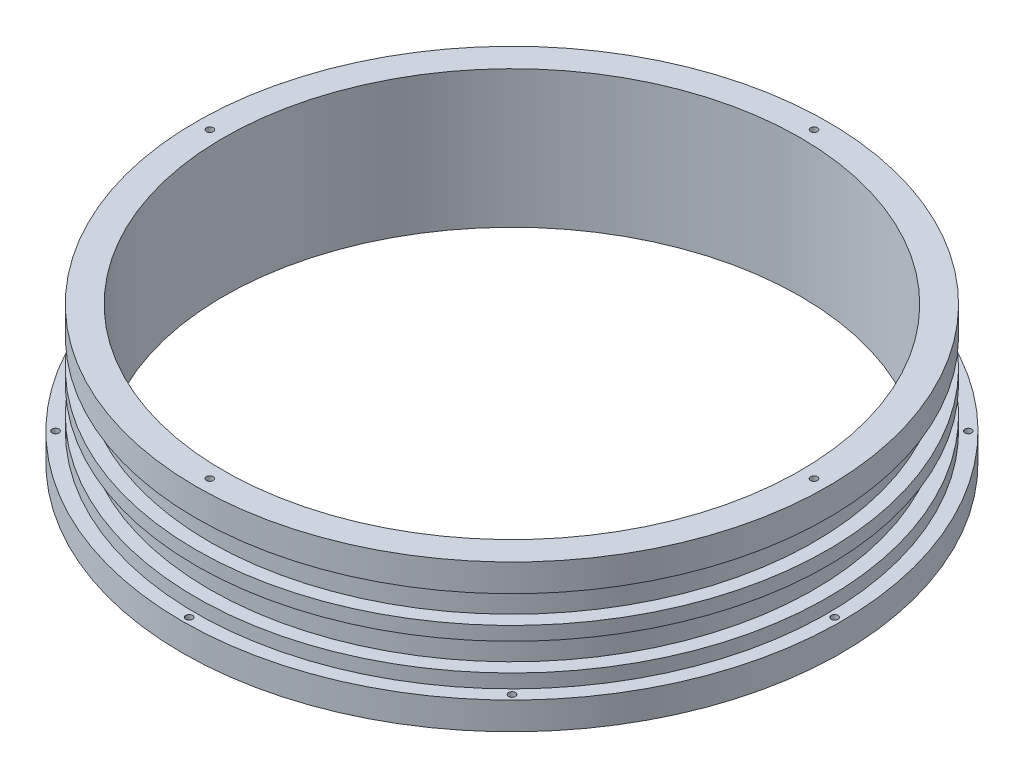
ISO-10303-21;
HEADER;
FILE_DESCRIPTION(('STEP AP214'),'2;1');
FILE_NAME('part.step','',(''),(''),'','','');
FILE_SCHEMA(('AUTOMOTIVE_DESIGN { 1 0 10303 214 1 1 1 1 }'));
ENDSEC;
DATA;
#1=APPLICATION_CONTEXT('core data for automotive mechanical design processes');
#2=APPLICATION_PROTOCOL_DEFINITION('international standard','automotive_design',2000,#1);
#3=PRODUCT_CONTEXT('',#1,'mechanical');
#4=PRODUCT('Part','Part','',(#3));
#5=PRODUCT_RELATED_PRODUCT_CATEGORY('part','',(#4));
#6=PRODUCT_DEFINITION_FORMATION('','',#4);
#7=PRODUCT_DEFINITION_CONTEXT('part definition',#1,'design');
#8=PRODUCT_DEFINITION('design','',#6,#7);
#9=PRODUCT_DEFINITION_SHAPE('','',#8);
#10=(LENGTH_UNIT() NAMED_UNIT(*) SI_UNIT(.MILLI.,.METRE.));
#11=(NAMED_UNIT(*) PLANE_ANGLE_UNIT() SI_UNIT($,.RADIAN.));
#12=(NAMED_UNIT(*) SI_UNIT($,.STERADIAN.) SOLID_ANGLE_UNIT());
#13=UNCERTAINTY_MEASURE_WITH_UNIT(LENGTH_MEASURE(1.E-05),#10,'distance_accuracy_value','');
#14=(GEOMETRIC_REPRESENTATION_CONTEXT(3) GLOBAL_UNCERTAINTY_ASSIGNED_CONTEXT((#13)) GLOBAL_UNIT_ASSIGNED_CONTEXT((#10,
#11,#12)) REPRESENTATION_CONTEXT('',''));
#15=CARTESIAN_POINT('',(0.,0.,0.));
#16=DIRECTION('',(0.,0.,1.));
#17=DIRECTION('',(1.,0.,0.));
#18=AXIS2_PLACEMENT_3D('',#15,#16,#17);
#19=CARTESIAN_POINT('',(0.,0.,0.));
#20=DIRECTION('',(0.,1.,0.));
#21=DIRECTION('',(0.,0.,1.));
#22=AXIS2_PLACEMENT_3D('',#19,#20,#21);
#23=PLANE('',#22);
#24=CARTESIAN_POINT('',(0.,0.,0.));
#25=DIRECTION('',(0.,-1.,0.));
#26=DIRECTION('',(0.,0.,-1.));
#27=AXIS2_PLACEMENT_3D('',#24,#25,#26);
#28=CIRCLE('',#27,66.675);
#29=CARTESIAN_POINT('',(0.,0.,-66.675));
#30=VERTEX_POINT('',#29);
#31=EDGE_CURVE('E73',#30,#30,#28,.T.);
#32=ORIENTED_EDGE('',*,*,#31,.F.);
#33=EDGE_LOOP('',(#32));
#34=FACE_BOUND('',#33,.T.);
#35=CARTESIAN_POINT('',(0.,0.,0.));
#36=DIRECTION('',(0.,-1.,0.));
#37=DIRECTION('',(0.,0.,-1.));
#38=AXIS2_PLACEMENT_3D('',#35,#36,#37);
#39=CIRCLE('',#38,69.85);
#40=CARTESIAN_POINT('',(0.,0.,-69.85));
#41=VERTEX_POINT('',#40);
#42=EDGE_CURVE('E133',#41,#41,#39,.T.);
#43=ORIENTED_EDGE('',*,*,#42,.T.);
#44=EDGE_LOOP('',(#43));
#45=FACE_BOUND('',#44,.T.);
#46=ADVANCED_FACE('F31',(#34,#45),#23,.F.);
#47=CARTESIAN_POINT('',(0.,19.05,0.));
#48=DIRECTION('',(0.,1.,0.));
#49=DIRECTION('',(0.,0.,1.));
#50=AXIS2_PLACEMENT_3D('',#47,#48,#49);
#51=PLANE('',#50);
#52=CARTESIAN_POINT('',(0.,19.05,0.));
#53=DIRECTION('',(0.,1.,0.));
#54=DIRECTION('',(0.,0.,1.));
#55=AXIS2_PLACEMENT_3D('',#52,#53,#54);
#56=CIRCLE('',#55,73.025);
#57=CARTESIAN_POINT('',(0.,19.05,73.025));
#58=VERTEX_POINT('',#57);
#59=EDGE_CURVE('E54',#58,#58,#56,.T.);
#60=ORIENTED_EDGE('',*,*,#59,.T.);
#61=EDGE_LOOP('',(#60));
#62=FACE_BOUND('',#61,.T.);
#63=CARTESIAN_POINT('',(0.,19.05,0.));
#64=DIRECTION('',(0.,1.,0.));
#65=DIRECTION('',(0.,0.,1.));
#66=AXIS2_PLACEMENT_3D('',#63,#64,#65);
#67=CIRCLE('',#66,69.85);
#68=CARTESIAN_POINT('',(0.,19.05,69.85));
#69=VERTEX_POINT('',#68);
#70=EDGE_CURVE('E61',#69,#69,#67,.T.);
#71=ORIENTED_EDGE('',*,*,#70,.F.);
#72=EDGE_LOOP('',(#71));
#73=FACE_BOUND('',#72,.T.);
#74=ADVANCED_FACE('F206',(#62,#73),#51,.T.);
#75=CARTESIAN_POINT('',(0.,9.525,0.));
#76=DIRECTION('',(0.,1.,0.));
#77=DIRECTION('',(0.,0.,1.));
#78=AXIS2_PLACEMENT_3D('',#75,#76,#77);
#79=PLANE('',#78);
#80=CARTESIAN_POINT('',(0.,9.525,0.));
#81=DIRECTION('',(0.,1.,0.));
#82=DIRECTION('',(0.,0.,1.));
#83=AXIS2_PLACEMENT_3D('',#80,#81,#82);
#84=CIRCLE('',#83,73.025);
#85=CARTESIAN_POINT('',(0.,9.525,-73.025));
#86=VERTEX_POINT('',#85);
#87=EDGE_CURVE('E48',#86,#86,#84,.T.);
#88=ORIENTED_EDGE('',*,*,#87,.T.);
#89=EDGE_LOOP('',(#88));
#90=FACE_BOUND('',#89,.T.);
#91=CARTESIAN_POINT('',(0.,9.525,0.));
#92=DIRECTION('',(0.,1.,0.));
#93=DIRECTION('',(0.,0.,1.));
#94=AXIS2_PLACEMENT_3D('',#91,#92,#93);
#95=CIRCLE('',#94,69.85);
#96=CARTESIAN_POINT('',(0.,9.525,69.85));
#97=VERTEX_POINT('',#96);
#98=EDGE_CURVE('E35',#97,#97,#95,.F.);
#99=ORIENTED_EDGE('',*,*,#98,.T.);
#100=EDGE_LOOP('',(#99));
#101=FACE_BOUND('',#100,.T.);
#102=ADVANCED_FACE('F208',(#90,#101),#79,.T.);
#103=CARTESIAN_POINT('',(0.,6.35,0.));
#104=DIRECTION('',(0.,1.,0.));
#105=DIRECTION('',(0.,0.,1.));
#106=AXIS2_PLACEMENT_3D('',#103,#104,#105);
#107=PLANE('',#106);
#108=CARTESIAN_POINT('',(-52.7590047112795,6.35,-52.7590047112769));
#109=DIRECTION('',(0.,1.,0.));
#110=DIRECTION('',(0.,0.,1.));
#111=AXIS2_PLACEMENT_3D('',#108,#109,#110);
#112=CIRCLE('',#111,0.793749999999999);
#113=CARTESIAN_POINT('',(-52.7590047112795,6.35,-51.9652547112769));
#114=VERTEX_POINT('',#113);
#115=EDGE_CURVE('E121',#114,#114,#112,.T.);
#116=ORIENTED_EDGE('',*,*,#115,.F.);
#117=EDGE_LOOP('',(#116));
#118=FACE_BOUND('',#117,.T.);
#119=CARTESIAN_POINT('',(-74.6124999999938,6.35,6.22677805551278E-12));
#120=DIRECTION('',(0.,1.,0.));
#121=DIRECTION('',(0.,0.,1.));
#122=AXIS2_PLACEMENT_3D('',#119,#120,#121);
#123=CIRCLE('',#122,0.793749999999993);
#124=CARTESIAN_POINT('',(-74.6124999999938,6.35,0.793750000006219));
#125=VERTEX_POINT('',#124);
#126=EDGE_CURVE('E115',#125,#125,#123,.T.);
#127=ORIENTED_EDGE('',*,*,#126,.F.);
#128=EDGE_LOOP('',(#127));
#129=FACE_BOUND('',#128,.T.);
#130=CARTESIAN_POINT('',(-52.7590047112707,6.35,52.7590047112857));
#131=DIRECTION('',(0.,1.,0.));
#132=DIRECTION('',(0.,0.,1.));
#133=AXIS2_PLACEMENT_3D('',#130,#131,#132);
#134=CIRCLE('',#133,0.793749999999993);
#135=CARTESIAN_POINT('',(-52.7590047112707,6.35,53.5527547112857));
#136=VERTEX_POINT('',#135);
#137=EDGE_CURVE('E109',#136,#136,#134,.T.);
#138=ORIENTED_EDGE('',*,*,#137,.F.);
#139=EDGE_LOOP('',(#138));
#140=FACE_BOUND('',#139,.T.);
#141=CARTESIAN_POINT('',(1.24352813191653E-11,6.35,74.6125));
#142=DIRECTION('',(0.,1.,0.));
#143=DIRECTION('',(0.,0.,1.));
#144=AXIS2_PLACEMENT_3D('',#141,#142,#143);
#145=CIRCLE('',#144,0.79375);
#146=CARTESIAN_POINT('',(1.24352813191653E-11,6.35,75.40625));
#147=VERTEX_POINT('',#146);
#148=EDGE_CURVE('E103',#147,#147,#145,.T.);
#149=ORIENTED_EDGE('',*,*,#148,.F.);
#150=EDGE_LOOP('',(#149));
#151=FACE_BOUND('',#150,.T.);
#152=CARTESIAN_POINT('',(52.7590047112919,6.35,52.7590047112769));
#153=DIRECTION('',(0.,1.,0.));
#154=DIRECTION('',(0.,0.,1.));
#155=AXIS2_PLACEMENT_3D('',#152,#153,#154);
#156=CIRCLE('',#155,0.793749999999993);
#157=CARTESIAN_POINT('',(52.7590047112919,6.35,53.5527547112769));
#158=VERTEX_POINT('',#157);
#159=EDGE_CURVE('E97',#158,#158,#156,.T.);
#160=ORIENTED_EDGE('',*,*,#159,.F.);
#161=EDGE_LOOP('',(#160));
#162=FACE_BOUND('',#161,.T.);
#163=CARTESIAN_POINT('',(74.6125000000062,6.35,-6.21764065958264E-12));
#164=DIRECTION('',(0.,1.,0.));
#165=DIRECTION('',(0.,0.,1.));
#166=AXIS2_PLACEMENT_3D('',#163,#164,#165);
#167=CIRCLE('',#166,0.793749999999993);
#168=CARTESIAN_POINT('',(74.6125000000062,6.35,0.793749999993775));
#169=VERTEX_POINT('',#168);
#170=EDGE_CURVE('E91',#169,#169,#167,.T.);
#171=ORIENTED_EDGE('',*,*,#170,.F.);
#172=EDGE_LOOP('',(#171));
#173=FACE_BOUND('',#172,.T.);
#174=CARTESIAN_POINT('',(52.7590047112831,6.35,-52.7590047112857));
#175=DIRECTION('',(0.,1.,0.));
#176=DIRECTION('',(0.,0.,1.));
#177=AXIS2_PLACEMENT_3D('',#174,#175,#176);
#178=CIRCLE('',#177,0.793749999999993);
#179=CARTESIAN_POINT('',(52.7590047112831,6.35,-51.9652547112857));
#180=VERTEX_POINT('',#179);
#181=EDGE_CURVE('E85',#180,#180,#178,.T.);
#182=ORIENTED_EDGE('',*,*,#181,.F.);
#183=EDGE_LOOP('',(#182));
#184=FACE_BOUND('',#183,.T.);
#185=CARTESIAN_POINT('',(0.,6.35,-74.6125));
#186=DIRECTION('',(0.,1.,0.));
#187=DIRECTION('',(0.,0.,1.));
#188=AXIS2_PLACEMENT_3D('',#185,#186,#187);
#189=CIRCLE('',#188,0.79375);
#190=CARTESIAN_POINT('',(0.,6.35,-73.81875));
#191=VERTEX_POINT('',#190);
#192=EDGE_CURVE('E79',#191,#191,#189,.T.);
#193=ORIENTED_EDGE('',*,*,#192,.F.);
#194=EDGE_LOOP('',(#193));
#195=FACE_BOUND('',#194,.T.);
#196=CARTESIAN_POINT('',(0.,6.35,0.));
#197=DIRECTION('',(0.,1.,0.));
#198=DIRECTION('',(0.,0.,1.));
#199=AXIS2_PLACEMENT_3D('',#196,#197,#198);
#200=CIRCLE('',#199,76.2);
#201=CARTESIAN_POINT('',(0.,6.35,76.2));
#202=VERTEX_POINT('',#201);
#203=EDGE_CURVE('E10',#202,#202,#200,.T.);
#204=ORIENTED_EDGE('',*,*,#203,.T.);
#205=EDGE_LOOP('',(#204));
#206=FACE_BOUND('',#205,.T.);
#207=CARTESIAN_POINT('',(0.,6.35,0.));
#208=DIRECTION('',(0.,1.,0.));
#209=DIRECTION('',(0.,0.,1.));
#210=AXIS2_PLACEMENT_3D('',#207,#208,#209);
#211=CIRCLE('',#210,73.025);
#212=CARTESIAN_POINT('',(0.,6.35,-73.025));
#213=VERTEX_POINT('',#212);
#214=EDGE_CURVE('E44',#213,#213,#211,.F.);
#215=ORIENTED_EDGE('',*,*,#214,.T.);
#216=EDGE_LOOP('',(#215));
#217=FACE_BOUND('',#216,.T.);
#218=ADVANCED_FACE('F215',(#118,#129,#140,#151,#162,#173,#184,#195,#206,#217),#107,.T.);
#219=CARTESIAN_POINT('',(0.,6.35,0.));
#220=DIRECTION('',(0.,-1.,0.));
#221=DIRECTION('',(0.,0.,-1.));
#222=AXIS2_PLACEMENT_3D('',#219,#220,#221);
#223=CYLINDRICAL_SURFACE('',#222,76.2);
#224=ORIENTED_EDGE('',*,*,#203,.F.);
#225=EDGE_LOOP('',(#224));
#226=FACE_BOUND('',#225,.T.);
#227=CARTESIAN_POINT('',(0.,0.,0.));
#228=DIRECTION('',(0.,1.,0.));
#229=DIRECTION('',(0.,0.,1.));
#230=AXIS2_PLACEMENT_3D('',#227,#228,#229);
#231=CIRCLE('',#230,76.2);
#232=CARTESIAN_POINT('',(0.,0.,76.2));
#233=VERTEX_POINT('',#232);
#234=EDGE_CURVE('E39',#233,#233,#231,.T.);
#235=ORIENTED_EDGE('',*,*,#234,.T.);
#236=EDGE_LOOP('',(#235));
#237=FACE_BOUND('',#236,.T.);
#238=ADVANCED_FACE('F33',(#226,#237),#223,.T.);
#239=CARTESIAN_POINT('',(0.,0.,0.));
#240=DIRECTION('',(0.,-1.,0.));
#241=DIRECTION('',(0.,0.,-1.));
#242=AXIS2_PLACEMENT_3D('',#239,#240,#241);
#243=CIRCLE('',#242,73.025);
#244=CARTESIAN_POINT('',(0.,0.,-73.025));
#245=VERTEX_POINT('',#244);
#246=EDGE_CURVE('E127',#245,#245,#243,.T.);
#247=ORIENTED_EDGE('',*,*,#246,.F.);
#248=EDGE_LOOP('',(#247));
#249=FACE_BOUND('',#248,.T.);
#250=CARTESIAN_POINT('',(-52.7590047112795,0.,-52.7590047112769));
#251=DIRECTION('',(0.,1.,0.));
#252=DIRECTION('',(0.,0.,1.));
#253=AXIS2_PLACEMENT_3D('',#250,#251,#252);
#254=CIRCLE('',#253,0.793749999999999);
#255=CARTESIAN_POINT('',(-52.7590047112795,0.,-51.9652547112769));
#256=VERTEX_POINT('',#255);
#257=EDGE_CURVE('E118',#256,#256,#254,.T.);
#258=ORIENTED_EDGE('',*,*,#257,.T.);
#259=EDGE_LOOP('',(#258));
#260=FACE_BOUND('',#259,.T.);
#261=CARTESIAN_POINT('',(-74.6124999999938,0.,6.22677805551278E-12));
#262=DIRECTION('',(0.,1.,0.));
#263=DIRECTION('',(0.,0.,1.));
#264=AXIS2_PLACEMENT_3D('',#261,#262,#263);
#265=CIRCLE('',#264,0.793749999999993);
#266=CARTESIAN_POINT('',(-74.6124999999938,0.,0.793750000006219));
#267=VERTEX_POINT('',#266);
#268=EDGE_CURVE('E112',#267,#267,#265,.T.);
#269=ORIENTED_EDGE('',*,*,#268,.T.);
#270=EDGE_LOOP('',(#269));
#271=FACE_BOUND('',#270,.T.);
#272=CARTESIAN_POINT('',(-52.7590047112707,0.,52.7590047112857));
#273=DIRECTION('',(0.,1.,0.));
#274=DIRECTION('',(0.,0.,1.));
#275=AXIS2_PLACEMENT_3D('',#272,#273,#274);
#276=CIRCLE('',#275,0.793749999999993);
#277=CARTESIAN_POINT('',(-52.7590047112707,0.,53.5527547112857));
#278=VERTEX_POINT('',#277);
#279=EDGE_CURVE('E106',#278,#278,#276,.T.);
#280=ORIENTED_EDGE('',*,*,#279,.T.);
#281=EDGE_LOOP('',(#280));
#282=FACE_BOUND('',#281,.T.);
#283=CARTESIAN_POINT('',(1.24352813191653E-11,0.,74.6125));
#284=DIRECTION('',(0.,1.,0.));
#285=DIRECTION('',(0.,0.,1.));
#286=AXIS2_PLACEMENT_3D('',#283,#284,#285);
#287=CIRCLE('',#286,0.79375);
#288=CARTESIAN_POINT('',(1.24352813191653E-11,0.,75.40625));
#289=VERTEX_POINT('',#288);
#290=EDGE_CURVE('E100',#289,#289,#287,.T.);
#291=ORIENTED_EDGE('',*,*,#290,.T.);
#292=EDGE_LOOP('',(#291));
#293=FACE_BOUND('',#292,.T.);
#294=CARTESIAN_POINT('',(52.7590047112919,0.,52.7590047112769));
#295=DIRECTION('',(0.,1.,0.));
#296=DIRECTION('',(0.,0.,1.));
#297=AXIS2_PLACEMENT_3D('',#294,#295,#296);
#298=CIRCLE('',#297,0.793749999999993);
#299=CARTESIAN_POINT('',(52.7590047112919,0.,53.5527547112769));
#300=VERTEX_POINT('',#299);
#301=EDGE_CURVE('E94',#300,#300,#298,.T.);
#302=ORIENTED_EDGE('',*,*,#301,.T.);
#303=EDGE_LOOP('',(#302));
#304=FACE_BOUND('',#303,.T.);
#305=CARTESIAN_POINT('',(74.6125000000062,0.,-6.21764065958264E-12));
#306=DIRECTION('',(0.,1.,0.));
#307=DIRECTION('',(0.,0.,1.));
#308=AXIS2_PLACEMENT_3D('',#305,#306,#307);
#309=CIRCLE('',#308,0.793749999999993);
#310=CARTESIAN_POINT('',(74.6125000000062,0.,0.793749999993775));
#311=VERTEX_POINT('',#310);
#312=EDGE_CURVE('E88',#311,#311,#309,.T.);
#313=ORIENTED_EDGE('',*,*,#312,.T.);
#314=EDGE_LOOP('',(#313));
#315=FACE_BOUND('',#314,.T.);
#316=CARTESIAN_POINT('',(52.7590047112831,0.,-52.7590047112857));
#317=DIRECTION('',(0.,1.,0.));
#318=DIRECTION('',(0.,0.,1.));
#319=AXIS2_PLACEMENT_3D('',#316,#317,#318);
#320=CIRCLE('',#319,0.793749999999993);
#321=CARTESIAN_POINT('',(52.7590047112831,0.,-51.9652547112857));
#322=VERTEX_POINT('',#321);
#323=EDGE_CURVE('E82',#322,#322,#320,.T.);
#324=ORIENTED_EDGE('',*,*,#323,.T.);
#325=EDGE_LOOP('',(#324));
#326=FACE_BOUND('',#325,.T.);
#327=CARTESIAN_POINT('',(0.,0.,-74.6125));
#328=DIRECTION('',(0.,1.,0.));
#329=DIRECTION('',(0.,0.,1.));
#330=AXIS2_PLACEMENT_3D('',#327,#328,#329);
#331=CIRCLE('',#330,0.79375);
#332=CARTESIAN_POINT('',(0.,0.,-73.81875));
#333=VERTEX_POINT('',#332);
#334=EDGE_CURVE('E76',#333,#333,#331,.T.);
#335=ORIENTED_EDGE('',*,*,#334,.T.);
#336=EDGE_LOOP('',(#335));
#337=FACE_BOUND('',#336,.T.);
#338=ORIENTED_EDGE('',*,*,#234,.F.);
#339=EDGE_LOOP('',(#338));
#340=FACE_BOUND('',#339,.T.);
#341=ADVANCED_FACE('F219',(#249,#260,#271,#282,#293,#304,#315,#326,#337,#340),#23,.F.);
#342=CARTESIAN_POINT('',(0.,9.525,0.));
#343=DIRECTION('',(0.,-1.,0.));
#344=DIRECTION('',(0.,0.,-1.));
#345=AXIS2_PLACEMENT_3D('',#342,#343,#344);
#346=CYLINDRICAL_SURFACE('',#345,73.025);
#347=CARTESIAN_POINT('',(0.,6.35,-73.025));
#348=CARTESIAN_POINT('',(0.,6.38307291666667,-73.025));
#349=CARTESIAN_POINT('',(0.,6.41614583333333,-73.025));
#350=CARTESIAN_POINT('',(0.,6.48229166666667,-73.025));
#351=CARTESIAN_POINT('',(0.,6.51536458333333,-73.025));
#352=CARTESIAN_POINT('',(0.,6.58151041666667,-73.025));
#353=CARTESIAN_POINT('',(0.,6.61458333333333,-73.025));
#354=CARTESIAN_POINT('',(0.,6.68072916666667,-73.025));
#355=CARTESIAN_POINT('',(0.,6.71380208333333,-73.025));
#356=CARTESIAN_POINT('',(0.,6.77994791666667,-73.025));
#357=CARTESIAN_POINT('',(0.,6.81302083333333,-73.025));
#358=CARTESIAN_POINT('',(0.,6.87916666666667,-73.025));
#359=CARTESIAN_POINT('',(0.,6.91223958333333,-73.025));
#360=CARTESIAN_POINT('',(0.,6.97838541666667,-73.025));
#361=CARTESIAN_POINT('',(0.,7.01145833333333,-73.025));
#362=CARTESIAN_POINT('',(0.,7.07760416666667,-73.025));
#363=CARTESIAN_POINT('',(0.,7.11067708333333,-73.025));
#364=CARTESIAN_POINT('',(0.,7.17682291666667,-73.025));
#365=CARTESIAN_POINT('',(0.,7.20989583333333,-73.025));
#366=CARTESIAN_POINT('',(0.,7.27604166666667,-73.025));
#367=CARTESIAN_POINT('',(0.,7.30911458333333,-73.025));
#368=CARTESIAN_POINT('',(0.,7.37526041666667,-73.025));
#369=CARTESIAN_POINT('',(0.,7.40833333333333,-73.025));
#370=CARTESIAN_POINT('',(0.,7.47447916666667,-73.025));
#371=CARTESIAN_POINT('',(0.,7.50755208333333,-73.025));
#372=CARTESIAN_POINT('',(0.,7.57369791666667,-73.025));
#373=CARTESIAN_POINT('',(0.,7.60677083333333,-73.025));
#374=CARTESIAN_POINT('',(0.,7.67291666666667,-73.025));
#375=CARTESIAN_POINT('',(0.,7.70598958333333,-73.025));
#376=CARTESIAN_POINT('',(0.,7.77213541666667,-73.025));
#377=CARTESIAN_POINT('',(0.,7.80520833333333,-73.025));
#378=CARTESIAN_POINT('',(0.,7.87135416666667,-73.025));
#379=CARTESIAN_POINT('',(0.,7.90442708333333,-73.025));
#380=CARTESIAN_POINT('',(0.,7.97057291666667,-73.025));
#381=CARTESIAN_POINT('',(0.,8.00364583333333,-73.025));
#382=CARTESIAN_POINT('',(0.,8.06979166666667,-73.025));
#383=CARTESIAN_POINT('',(0.,8.10286458333333,-73.025));
#384=CARTESIAN_POINT('',(0.,8.16901041666667,-73.025));
#385=CARTESIAN_POINT('',(0.,8.20208333333333,-73.025));
#386=CARTESIAN_POINT('',(0.,8.26822916666667,-73.025));
#387=CARTESIAN_POINT('',(0.,8.30130208333333,-73.025));
#388=CARTESIAN_POINT('',(0.,8.36744791666667,-73.025));
#389=CARTESIAN_POINT('',(0.,8.40052083333333,-73.025));
#390=CARTESIAN_POINT('',(0.,8.46666666666667,-73.025));
#391=CARTESIAN_POINT('',(0.,8.49973958333333,-73.025));
#392=CARTESIAN_POINT('',(0.,8.56588541666667,-73.025));
#393=CARTESIAN_POINT('',(0.,8.59895833333333,-73.025));
#394=CARTESIAN_POINT('',(0.,8.66510416666667,-73.025));
#395=CARTESIAN_POINT('',(0.,8.69817708333333,-73.025));
#396=CARTESIAN_POINT('',(0.,8.76432291666667,-73.025));
#397=CARTESIAN_POINT('',(0.,8.79739583333333,-73.025));
#398=CARTESIAN_POINT('',(0.,8.86354166666666,-73.025));
#399=CARTESIAN_POINT('',(0.,8.89661458333333,-73.025));
#400=CARTESIAN_POINT('',(0.,8.96276041666667,-73.025));
#401=CARTESIAN_POINT('',(0.,8.99583333333333,-73.025));
#402=CARTESIAN_POINT('',(0.,9.06197916666667,-73.025));
#403=CARTESIAN_POINT('',(0.,9.09505208333333,-73.025));
#404=CARTESIAN_POINT('',(0.,9.16119791666667,-73.025));
#405=CARTESIAN_POINT('',(0.,9.19427083333333,-73.025));
#406=CARTESIAN_POINT('',(0.,9.26041666666667,-73.025));
#407=CARTESIAN_POINT('',(0.,9.29348958333333,-73.025));
#408=CARTESIAN_POINT('',(0.,9.35963541666667,-73.025));
#409=CARTESIAN_POINT('',(0.,9.39270833333333,-73.025));
#410=CARTESIAN_POINT('',(0.,9.45885416666667,-73.025));
#411=CARTESIAN_POINT('',(0.,9.49192708333333,-73.025));
#412=CARTESIAN_POINT('',(0.,9.525,-73.025));
#413=B_SPLINE_CURVE_WITH_KNOTS('',3,(#347,#348,#349,#350,#351,#352,#353,#354,#355,#356,#357,
#358,#359,#360,#361,#362,#363,#364,#365,#366,#367,#368,#369,#370,#371,#372,#373,#374,#375,#376,
#377,#378,#379,#380,#381,#382,#383,#384,#385,#386,#387,#388,#389,#390,#391,#392,#393,#394,#395,
#396,#397,#398,#399,#400,#401,#402,#403,#404,#405,#406,#407,#408,#409,#410,#411,#412),
.UNSPECIFIED.,.F.,.F.,(4,2,2,2,2,2,2,2,2,2,2,2,2,2,2,2,2,2,2,2,2,2,2,2,2,2,2,2,2,2,2,2,4),(0.,
0.0992187499999995,0.198437499999999,0.29765625,0.396875,0.496093749999999,0.5953125,0.69453125,
0.793749999999999,0.89296875,0.9921875,1.09140625,1.190625,1.28984375,1.3890625,1.48828125,
1.5875,1.68671875,1.7859375,1.88515625,1.984375,2.08359375,2.1828125,2.28203125,2.38125,
2.48046875,2.5796875,2.67890625,2.778125,2.87734375,2.9765625,3.07578125,3.175),.UNSPECIFIED.);
#414=EDGE_CURVE('BSEAM230',#213,#86,#413,.T.);
#415=ORIENTED_EDGE('',*,*,#214,.F.);
#416=ORIENTED_EDGE('',*,*,#87,.F.);
#417=ORIENTED_EDGE('',*,*,#414,.T.);
#418=ORIENTED_EDGE('',*,*,#414,.F.);
#419=EDGE_LOOP('',(#415,#417,#416,#418));
#420=FACE_BOUND('',#419,.T.);
#421=ADVANCED_FACE('F230',(#420),#346,.T.);
#422=CARTESIAN_POINT('',(0.,15.875,0.));
#423=DIRECTION('',(0.,-1.,0.));
#424=DIRECTION('',(0.,0.,-1.));
#425=AXIS2_PLACEMENT_3D('',#422,#423,#424);
#426=CYLINDRICAL_SURFACE('',#425,69.85);
#427=ORIENTED_EDGE('',*,*,#98,.F.);
#428=EDGE_LOOP('',(#427));
#429=FACE_BOUND('',#428,.T.);
#430=CARTESIAN_POINT('',(0.,15.875,0.));
#431=DIRECTION('',(0.,1.,0.));
#432=DIRECTION('',(0.,0.,1.));
#433=AXIS2_PLACEMENT_3D('',#430,#431,#432);
#434=CIRCLE('',#433,69.85);
#435=CARTESIAN_POINT('',(0.,15.875,69.85));
#436=VERTEX_POINT('',#435);
#437=EDGE_CURVE('E51',#436,#436,#434,.T.);
#438=ORIENTED_EDGE('',*,*,#437,.F.);
#439=EDGE_LOOP('',(#438));
#440=FACE_BOUND('',#439,.T.);
#441=ADVANCED_FACE('F224',(#429,#440),#426,.T.);
#442=CARTESIAN_POINT('',(0.,15.875,0.));
#443=DIRECTION('',(0.,1.,0.));
#444=DIRECTION('',(0.,0.,1.));
#445=AXIS2_PLACEMENT_3D('',#442,#443,#444);
#446=PLANE('',#445);
#447=CARTESIAN_POINT('',(0.,15.875,0.));
#448=DIRECTION('',(0.,1.,0.));
#449=DIRECTION('',(0.,0.,1.));
#450=AXIS2_PLACEMENT_3D('',#447,#448,#449);
#451=CIRCLE('',#450,73.025);
#452=CARTESIAN_POINT('',(0.,15.875,73.025));
#453=VERTEX_POINT('',#452);
#454=EDGE_CURVE('E55',#453,#453,#451,.T.);
#455=ORIENTED_EDGE('',*,*,#454,.F.);
#456=EDGE_LOOP('',(#455));
#457=FACE_BOUND('',#456,.T.);
#458=ORIENTED_EDGE('',*,*,#437,.T.);
#459=EDGE_LOOP('',(#458));
#460=FACE_BOUND('',#459,.T.);
#461=ADVANCED_FACE('F221',(#457,#460),#446,.F.);
#462=CARTESIAN_POINT('',(0.,19.05,0.));
#463=DIRECTION('',(0.,-1.,0.));
#464=DIRECTION('',(0.,0.,-1.));
#465=AXIS2_PLACEMENT_3D('',#462,#463,#464);
#466=CYLINDRICAL_SURFACE('',#465,73.025);
#467=ORIENTED_EDGE('',*,*,#59,.F.);
#468=EDGE_LOOP('',(#467));
#469=FACE_BOUND('',#468,.T.);
#470=ORIENTED_EDGE('',*,*,#454,.T.);
#471=EDGE_LOOP('',(#470));
#472=FACE_BOUND('',#471,.T.);
#473=ADVANCED_FACE('F202',(#469,#472),#466,.T.);
#474=CARTESIAN_POINT('',(0.,25.4,0.));
#475=DIRECTION('',(0.,-1.,0.));
#476=DIRECTION('',(0.,0.,-1.));
#477=AXIS2_PLACEMENT_3D('',#474,#475,#476);
#478=CYLINDRICAL_SURFACE('',#477,69.85);
#479=CARTESIAN_POINT('',(0.,25.4,0.));
#480=DIRECTION('',(0.,1.,0.));
#481=DIRECTION('',(0.,0.,1.));
#482=AXIS2_PLACEMENT_3D('',#479,#480,#481);
#483=CIRCLE('',#482,69.85);
#484=CARTESIAN_POINT('',(0.,25.4,69.85));
#485=VERTEX_POINT('',#484);
#486=EDGE_CURVE('E58',#485,#485,#483,.T.);
#487=ORIENTED_EDGE('',*,*,#486,.F.);
#488=EDGE_LOOP('',(#487));
#489=FACE_BOUND('',#488,.T.);
#490=ORIENTED_EDGE('',*,*,#70,.T.);
#491=EDGE_LOOP('',(#490));
#492=FACE_BOUND('',#491,.T.);
#493=ADVANCED_FACE('F196',(#489,#492),#478,.T.);
#494=CARTESIAN_POINT('',(0.,25.4,0.));
#495=DIRECTION('',(0.,1.,0.));
#496=DIRECTION('',(0.,0.,1.));
#497=AXIS2_PLACEMENT_3D('',#494,#495,#496);
#498=PLANE('',#497);
#499=CARTESIAN_POINT('',(0.,25.4,0.));
#500=DIRECTION('',(0.,1.,0.));
#501=DIRECTION('',(0.,0.,1.));
#502=AXIS2_PLACEMENT_3D('',#499,#500,#501);
#503=CIRCLE('',#502,73.025);
#504=CARTESIAN_POINT('',(0.,25.4,73.025));
#505=VERTEX_POINT('',#504);
#506=EDGE_CURVE('E67',#505,#505,#503,.T.);
#507=ORIENTED_EDGE('',*,*,#506,.F.);
#508=EDGE_LOOP('',(#507));
#509=FACE_BOUND('',#508,.T.);
#510=ORIENTED_EDGE('',*,*,#486,.T.);
#511=EDGE_LOOP('',(#510));
#512=FACE_BOUND('',#511,.T.);
#513=ADVANCED_FACE('F190',(#509,#512),#498,.F.);
#514=CARTESIAN_POINT('',(0.,31.75,0.));
#515=DIRECTION('',(0.,-1.,0.));
#516=DIRECTION('',(0.,0.,-1.));
#517=AXIS2_PLACEMENT_3D('',#514,#515,#516);
#518=CYLINDRICAL_SURFACE('',#517,73.025);
#519=CARTESIAN_POINT('',(0.,31.75,0.));
#520=DIRECTION('',(0.,1.,0.));
#521=DIRECTION('',(0.,0.,1.));
#522=AXIS2_PLACEMENT_3D('',#519,#520,#521);
#523=CIRCLE('',#522,73.025);
#524=CARTESIAN_POINT('',(0.,31.75,73.025));
#525=VERTEX_POINT('',#524);
#526=EDGE_CURVE('E64',#525,#525,#523,.T.);
#527=ORIENTED_EDGE('',*,*,#526,.F.);
#528=EDGE_LOOP('',(#527));
#529=FACE_BOUND('',#528,.T.);
#530=ORIENTED_EDGE('',*,*,#506,.T.);
#531=EDGE_LOOP('',(#530));
#532=FACE_BOUND('',#531,.T.);
#533=ADVANCED_FACE('F176',(#529,#532),#518,.T.);
#534=CARTESIAN_POINT('',(0.,31.75,0.));
#535=DIRECTION('',(0.,1.,0.));
#536=DIRECTION('',(0.,0.,1.));
#537=AXIS2_PLACEMENT_3D('',#534,#535,#536);
#538=PLANE('',#537);
#539=CARTESIAN_POINT('',(69.85,31.75,7.31640338320471E-13));
#540=DIRECTION('',(0.,1.,0.));
#541=DIRECTION('',(0.,0.,1.));
#542=AXIS2_PLACEMENT_3D('',#539,#540,#541);
#543=CIRCLE('',#542,0.793749999999998);
#544=CARTESIAN_POINT('',(69.85,31.75,0.79375000000073));
#545=VERTEX_POINT('',#544);
#546=EDGE_CURVE('E157',#545,#545,#543,.T.);
#547=ORIENTED_EDGE('',*,*,#546,.F.);
#548=EDGE_LOOP('',(#547));
#549=FACE_BOUND('',#548,.T.);
#550=CARTESIAN_POINT('',(4.87760225546981E-13,31.75,-69.85));
#551=DIRECTION('',(0.,1.,0.));
#552=DIRECTION('',(0.,0.,1.));
#553=AXIS2_PLACEMENT_3D('',#550,#551,#552);
#554=CIRCLE('',#553,0.793750000000001);
#555=CARTESIAN_POINT('',(4.87760225546981E-13,31.75,-69.05625));
#556=VERTEX_POINT('',#555);
#557=EDGE_CURVE('E151',#556,#556,#554,.T.);
#558=ORIENTED_EDGE('',*,*,#557,.F.);
#559=EDGE_LOOP('',(#558));
#560=FACE_BOUND('',#559,.T.);
#561=CARTESIAN_POINT('',(-69.85,31.75,-2.4388011277349E-13));
#562=DIRECTION('',(0.,1.,0.));
#563=DIRECTION('',(0.,0.,1.));
#564=AXIS2_PLACEMENT_3D('',#561,#562,#563);
#565=CIRCLE('',#564,0.793750000000001);
#566=CARTESIAN_POINT('',(-69.85,31.75,0.793749999999757));
#567=VERTEX_POINT('',#566);
#568=EDGE_CURVE('E145',#567,#567,#565,.T.);
#569=ORIENTED_EDGE('',*,*,#568,.F.);
#570=EDGE_LOOP('',(#569));
#571=FACE_BOUND('',#570,.T.);
#572=CARTESIAN_POINT('',(0.,31.75,69.85));
#573=DIRECTION('',(0.,1.,0.));
#574=DIRECTION('',(0.,0.,1.));
#575=AXIS2_PLACEMENT_3D('',#572,#573,#574);
#576=CIRCLE('',#575,0.79375);
#577=CARTESIAN_POINT('',(0.,31.75,70.64375));
#578=VERTEX_POINT('',#577);
#579=EDGE_CURVE('E139',#578,#578,#576,.T.);
#580=ORIENTED_EDGE('',*,*,#579,.F.);
#581=EDGE_LOOP('',(#580));
#582=FACE_BOUND('',#581,.T.);
#583=CARTESIAN_POINT('',(0.,31.75,0.));
#584=DIRECTION('',(0.,-1.,0.));
#585=DIRECTION('',(0.,0.,-1.));
#586=AXIS2_PLACEMENT_3D('',#583,#584,#585);
#587=CIRCLE('',#586,66.675);
#588=CARTESIAN_POINT('',(0.,31.75,-66.675));
#589=VERTEX_POINT('',#588);
#590=EDGE_CURVE('E70',#589,#589,#587,.T.);
#591=ORIENTED_EDGE('',*,*,#590,.T.);
#592=EDGE_LOOP('',(#591));
#593=FACE_BOUND('',#592,.T.);
#594=ORIENTED_EDGE('',*,*,#526,.T.);
#595=EDGE_LOOP('',(#594));
#596=FACE_BOUND('',#595,.T.);
#597=ADVANCED_FACE('F172',(#549,#560,#571,#582,#593,#596),#538,.T.);
#598=CARTESIAN_POINT('',(0.,31.75,0.));
#599=DIRECTION('',(0.,-1.,0.));
#600=DIRECTION('',(0.,0.,-1.));
#601=AXIS2_PLACEMENT_3D('',#598,#599,#600);
#602=CYLINDRICAL_SURFACE('',#601,66.675);
#603=ORIENTED_EDGE('',*,*,#590,.F.);
#604=EDGE_LOOP('',(#603));
#605=FACE_BOUND('',#604,.T.);
#606=ORIENTED_EDGE('',*,*,#31,.T.);
#607=EDGE_LOOP('',(#606));
#608=FACE_BOUND('',#607,.T.);
#609=ADVANCED_FACE('F175',(#605,#608),#602,.F.);
#610=CARTESIAN_POINT('',(0.,0.,-74.6125));
#611=DIRECTION('',(0.,1.,0.));
#612=DIRECTION('',(0.,0.,1.));
#613=AXIS2_PLACEMENT_3D('',#610,#611,#612);
#614=CYLINDRICAL_SURFACE('',#613,0.79375);
#615=ORIENTED_EDGE('',*,*,#334,.F.);
#616=EDGE_LOOP('',(#615));
#617=FACE_BOUND('',#616,.T.);
#618=ORIENTED_EDGE('',*,*,#192,.T.);
#619=EDGE_LOOP('',(#618));
#620=FACE_BOUND('',#619,.T.);
#621=ADVANCED_FACE('F265',(#617,#620),#614,.F.);
#622=CARTESIAN_POINT('',(52.7590047112831,0.,-52.7590047112857));
#623=DIRECTION('',(0.,1.,0.));
#624=DIRECTION('',(0.,0.,1.));
#625=AXIS2_PLACEMENT_3D('',#622,#623,#624);
#626=CYLINDRICAL_SURFACE('',#625,0.793749999999993);
#627=ORIENTED_EDGE('',*,*,#323,.F.);
#628=EDGE_LOOP('',(#627));
#629=FACE_BOUND('',#628,.T.);
#630=ORIENTED_EDGE('',*,*,#181,.T.);
#631=EDGE_LOOP('',(#630));
#632=FACE_BOUND('',#631,.T.);
#633=ADVANCED_FACE('F268',(#629,#632),#626,.F.);
#634=CARTESIAN_POINT('',(74.6125000000062,0.,-6.21764065958264E-12));
#635=DIRECTION('',(0.,1.,0.));
#636=DIRECTION('',(0.,0.,1.));
#637=AXIS2_PLACEMENT_3D('',#634,#635,#636);
#638=CYLINDRICAL_SURFACE('',#637,0.793749999999993);
#639=ORIENTED_EDGE('',*,*,#312,.F.);
#640=EDGE_LOOP('',(#639));
#641=FACE_BOUND('',#640,.T.);
#642=ORIENTED_EDGE('',*,*,#170,.T.);
#643=EDGE_LOOP('',(#642));
#644=FACE_BOUND('',#643,.T.);
#645=ADVANCED_FACE('F286',(#641,#644),#638,.F.);
#646=CARTESIAN_POINT('',(52.7590047112919,0.,52.7590047112769));
#647=DIRECTION('',(0.,1.,0.));
#648=DIRECTION('',(0.,0.,1.));
#649=AXIS2_PLACEMENT_3D('',#646,#647,#648);
#650=CYLINDRICAL_SURFACE('',#649,0.793749999999993);
#651=ORIENTED_EDGE('',*,*,#301,.F.);
#652=EDGE_LOOP('',(#651));
#653=FACE_BOUND('',#652,.T.);
#654=ORIENTED_EDGE('',*,*,#159,.T.);
#655=EDGE_LOOP('',(#654));
#656=FACE_BOUND('',#655,.T.);
#657=ADVANCED_FACE('F294',(#653,#656),#650,.F.);
#658=CARTESIAN_POINT('',(1.24352813191653E-11,0.,74.6125));
#659=DIRECTION('',(0.,1.,0.));
#660=DIRECTION('',(0.,0.,1.));
#661=AXIS2_PLACEMENT_3D('',#658,#659,#660);
#662=CYLINDRICAL_SURFACE('',#661,0.79375);
#663=ORIENTED_EDGE('',*,*,#290,.F.);
#664=EDGE_LOOP('',(#663));
#665=FACE_BOUND('',#664,.T.);
#666=ORIENTED_EDGE('',*,*,#148,.T.);
#667=EDGE_LOOP('',(#666));
#668=FACE_BOUND('',#667,.T.);
#669=ADVANCED_FACE('F298',(#665,#668),#662,.F.);
#670=CARTESIAN_POINT('',(-52.7590047112707,0.,52.7590047112857));
#671=DIRECTION('',(0.,1.,0.));
#672=DIRECTION('',(0.,0.,1.));
#673=AXIS2_PLACEMENT_3D('',#670,#671,#672);
#674=CYLINDRICAL_SURFACE('',#673,0.793749999999993);
#675=ORIENTED_EDGE('',*,*,#279,.F.);
#676=EDGE_LOOP('',(#675));
#677=FACE_BOUND('',#676,.T.);
#678=ORIENTED_EDGE('',*,*,#137,.T.);
#679=EDGE_LOOP('',(#678));
#680=FACE_BOUND('',#679,.T.);
#681=ADVANCED_FACE('F302',(#677,#680),#674,.F.);
#682=CARTESIAN_POINT('',(-74.6124999999938,0.,6.22677805551278E-12));
#683=DIRECTION('',(0.,1.,0.));
#684=DIRECTION('',(0.,0.,1.));
#685=AXIS2_PLACEMENT_3D('',#682,#683,#684);
#686=CYLINDRICAL_SURFACE('',#685,0.793749999999993);
#687=ORIENTED_EDGE('',*,*,#268,.F.);
#688=EDGE_LOOP('',(#687));
#689=FACE_BOUND('',#688,.T.);
#690=ORIENTED_EDGE('',*,*,#126,.T.);
#691=EDGE_LOOP('',(#690));
#692=FACE_BOUND('',#691,.T.);
#693=ADVANCED_FACE('F306',(#689,#692),#686,.F.);
#694=CARTESIAN_POINT('',(-52.7590047112795,0.,-52.7590047112769));
#695=DIRECTION('',(0.,1.,0.));
#696=DIRECTION('',(0.,0.,1.));
#697=AXIS2_PLACEMENT_3D('',#694,#695,#696);
#698=CYLINDRICAL_SURFACE('',#697,0.793749999999999);
#699=ORIENTED_EDGE('',*,*,#257,.F.);
#700=EDGE_LOOP('',(#699));
#701=FACE_BOUND('',#700,.T.);
#702=ORIENTED_EDGE('',*,*,#115,.T.);
#703=EDGE_LOOP('',(#702));
#704=FACE_BOUND('',#703,.T.);
#705=ADVANCED_FACE('F310',(#701,#704),#698,.F.);
#706=CARTESIAN_POINT('',(0.,3.175,0.));
#707=DIRECTION('',(0.,-1.,0.));
#708=DIRECTION('',(0.,0.,-1.));
#709=AXIS2_PLACEMENT_3D('',#706,#707,#708);
#710=CYLINDRICAL_SURFACE('',#709,73.025);
#711=CARTESIAN_POINT('',(0.,3.175,0.));
#712=DIRECTION('',(0.,-1.,0.));
#713=DIRECTION('',(0.,0.,-1.));
#714=AXIS2_PLACEMENT_3D('',#711,#712,#713);
#715=CIRCLE('',#714,73.025);
#716=CARTESIAN_POINT('',(0.,3.175,-73.025));
#717=VERTEX_POINT('',#716);
#718=EDGE_CURVE('E124',#717,#717,#715,.T.);
#719=ORIENTED_EDGE('',*,*,#718,.F.);
#720=EDGE_LOOP('',(#719));
#721=FACE_BOUND('',#720,.T.);
#722=ORIENTED_EDGE('',*,*,#246,.T.);
#723=EDGE_LOOP('',(#722));
#724=FACE_BOUND('',#723,.T.);
#725=ADVANCED_FACE('F314',(#721,#724),#710,.F.);
#726=CARTESIAN_POINT('',(0.,3.175,0.));
#727=DIRECTION('',(0.,-1.,0.));
#728=DIRECTION('',(0.,0.,-1.));
#729=AXIS2_PLACEMENT_3D('',#726,#727,#728);
#730=PLANE('',#729);
#731=CARTESIAN_POINT('',(0.,3.175,0.));
#732=DIRECTION('',(0.,-1.,0.));
#733=DIRECTION('',(0.,0.,-1.));
#734=AXIS2_PLACEMENT_3D('',#731,#732,#733);
#735=CIRCLE('',#734,69.85);
#736=CARTESIAN_POINT('',(0.,3.175,-69.85));
#737=VERTEX_POINT('',#736);
#738=EDGE_CURVE('E130',#737,#737,#735,.T.);
#739=ORIENTED_EDGE('',*,*,#738,.F.);
#740=EDGE_LOOP('',(#739));
#741=FACE_BOUND('',#740,.T.);
#742=ORIENTED_EDGE('',*,*,#718,.T.);
#743=EDGE_LOOP('',(#742));
#744=FACE_BOUND('',#743,.T.);
#745=ADVANCED_FACE('F318',(#741,#744),#730,.T.);
#746=CARTESIAN_POINT('',(0.,3.175,0.));
#747=DIRECTION('',(0.,-1.,0.));
#748=DIRECTION('',(0.,0.,-1.));
#749=AXIS2_PLACEMENT_3D('',#746,#747,#748);
#750=CYLINDRICAL_SURFACE('',#749,69.85);
#751=ORIENTED_EDGE('',*,*,#738,.T.);
#752=EDGE_LOOP('',(#751));
#753=FACE_BOUND('',#752,.T.);
#754=ORIENTED_EDGE('',*,*,#42,.F.);
#755=EDGE_LOOP('',(#754));
#756=FACE_BOUND('',#755,.T.);
#757=ADVANCED_FACE('F322',(#753,#756),#750,.T.);
#758=CARTESIAN_POINT('',(0.,28.575,69.85));
#759=DIRECTION('',(0.,1.,0.));
#760=DIRECTION('',(0.,0.,1.));
#761=AXIS2_PLACEMENT_3D('',#758,#759,#760);
#762=CYLINDRICAL_SURFACE('',#761,0.79375);
#763=CARTESIAN_POINT('',(0.,28.575,69.85));
#764=DIRECTION('',(0.,1.,0.));
#765=DIRECTION('',(0.,0.,1.));
#766=AXIS2_PLACEMENT_3D('',#763,#764,#765);
#767=CIRCLE('',#766,0.79375);
#768=CARTESIAN_POINT('',(0.,28.575,70.64375));
#769=VERTEX_POINT('',#768);
#770=EDGE_CURVE('E136',#769,#769,#767,.T.);
#771=ORIENTED_EDGE('',*,*,#770,.F.);
#772=EDGE_LOOP('',(#771));
#773=FACE_BOUND('',#772,.T.);
#774=ORIENTED_EDGE('',*,*,#579,.T.);
#775=EDGE_LOOP('',(#774));
#776=FACE_BOUND('',#775,.T.);
#777=ADVANCED_FACE('F326',(#773,#776),#762,.F.);
#778=CARTESIAN_POINT('',(0.,28.575,69.85));
#779=DIRECTION('',(0.,1.,0.));
#780=DIRECTION('',(0.,0.,1.));
#781=AXIS2_PLACEMENT_3D('',#778,#779,#780);
#782=PLANE('',#781);
#783=ORIENTED_EDGE('',*,*,#770,.T.);
#784=EDGE_LOOP('',(#783));
#785=FACE_BOUND('',#784,.T.);
#786=ADVANCED_FACE('F330',(#785),#782,.T.);
#787=CARTESIAN_POINT('',(-69.85,28.575,-2.4388011277349E-13));
#788=DIRECTION('',(0.,1.,0.));
#789=DIRECTION('',(0.,0.,1.));
#790=AXIS2_PLACEMENT_3D('',#787,#788,#789);
#791=CYLINDRICAL_SURFACE('',#790,0.793750000000001);
#792=CARTESIAN_POINT('',(-69.85,28.575,-2.4388011277349E-13));
#793=DIRECTION('',(0.,1.,0.));
#794=DIRECTION('',(0.,0.,1.));
#795=AXIS2_PLACEMENT_3D('',#792,#793,#794);
#796=CIRCLE('',#795,0.793750000000001);
#797=CARTESIAN_POINT('',(-69.85,28.575,0.793749999999757));
#798=VERTEX_POINT('',#797);
#799=EDGE_CURVE('E142',#798,#798,#796,.T.);
#800=ORIENTED_EDGE('',*,*,#799,.F.);
#801=EDGE_LOOP('',(#800));
#802=FACE_BOUND('',#801,.T.);
#803=ORIENTED_EDGE('',*,*,#568,.T.);
#804=EDGE_LOOP('',(#803));
#805=FACE_BOUND('',#804,.T.);
#806=ADVANCED_FACE('F334',(#802,#805),#791,.F.);
#807=CARTESIAN_POINT('',(-69.85,28.575,-2.4388011277349E-13));
#808=DIRECTION('',(0.,1.,0.));
#809=DIRECTION('',(0.,0.,1.));
#810=AXIS2_PLACEMENT_3D('',#807,#808,#809);
#811=PLANE('',#810);
#812=ORIENTED_EDGE('',*,*,#799,.T.);
#813=EDGE_LOOP('',(#812));
#814=FACE_BOUND('',#813,.T.);
#815=ADVANCED_FACE('F338',(#814),#811,.T.);
#816=CARTESIAN_POINT('',(4.87760225546981E-13,28.575,-69.85));
#817=DIRECTION('',(0.,1.,0.));
#818=DIRECTION('',(0.,0.,1.));
#819=AXIS2_PLACEMENT_3D('',#816,#817,#818);
#820=CYLINDRICAL_SURFACE('',#819,0.793750000000001);
#821=CARTESIAN_POINT('',(4.87760225546981E-13,28.575,-69.85));
#822=DIRECTION('',(0.,1.,0.));
#823=DIRECTION('',(0.,0.,1.));
#824=AXIS2_PLACEMENT_3D('',#821,#822,#823);
#825=CIRCLE('',#824,0.793750000000001);
#826=CARTESIAN_POINT('',(4.87760225546981E-13,28.575,-69.05625));
#827=VERTEX_POINT('',#826);
#828=EDGE_CURVE('E148',#827,#827,#825,.T.);
#829=ORIENTED_EDGE('',*,*,#828,.F.);
#830=EDGE_LOOP('',(#829));
#831=FACE_BOUND('',#830,.T.);
#832=ORIENTED_EDGE('',*,*,#557,.T.);
#833=EDGE_LOOP('',(#832));
#834=FACE_BOUND('',#833,.T.);
#835=ADVANCED_FACE('F342',(#831,#834),#820,.F.);
#836=CARTESIAN_POINT('',(4.87760225546981E-13,28.575,-69.85));
#837=DIRECTION('',(0.,1.,0.));
#838=DIRECTION('',(0.,0.,1.));
#839=AXIS2_PLACEMENT_3D('',#836,#837,#838);
#840=PLANE('',#839);
#841=ORIENTED_EDGE('',*,*,#828,.T.);
#842=EDGE_LOOP('',(#841));
#843=FACE_BOUND('',#842,.T.);
#844=ADVANCED_FACE('F168',(#843),#840,.T.);
#845=CARTESIAN_POINT('',(69.85,28.575,7.31640338320471E-13));
#846=DIRECTION('',(0.,1.,0.));
#847=DIRECTION('',(0.,0.,1.));
#848=AXIS2_PLACEMENT_3D('',#845,#846,#847);
#849=CYLINDRICAL_SURFACE('',#848,0.793749999999998);
#850=CARTESIAN_POINT('',(69.85,28.575,7.31640338320471E-13));
#851=DIRECTION('',(0.,1.,0.));
#852=DIRECTION('',(0.,0.,1.));
#853=AXIS2_PLACEMENT_3D('',#850,#851,#852);
#854=CIRCLE('',#853,0.793749999999998);
#855=CARTESIAN_POINT('',(69.85,28.575,0.79375000000073));
#856=VERTEX_POINT('',#855);
#857=EDGE_CURVE('E154',#856,#856,#854,.T.);
#858=ORIENTED_EDGE('',*,*,#857,.F.);
#859=EDGE_LOOP('',(#858));
#860=FACE_BOUND('',#859,.T.);
#861=ORIENTED_EDGE('',*,*,#546,.T.);
#862=EDGE_LOOP('',(#861));
#863=FACE_BOUND('',#862,.T.);
#864=ADVANCED_FACE('F165',(#860,#863),#849,.F.);
#865=CARTESIAN_POINT('',(69.85,28.575,7.31640338320471E-13));
#866=DIRECTION('',(0.,1.,0.));
#867=DIRECTION('',(0.,0.,1.));
#868=AXIS2_PLACEMENT_3D('',#865,#866,#867);
#869=PLANE('',#868);
#870=ORIENTED_EDGE('',*,*,#857,.T.);
#871=EDGE_LOOP('',(#870));
#872=FACE_BOUND('',#871,.T.);
#873=ADVANCED_FACE('F163',(#872),#869,.T.);
#874=CLOSED_SHELL('',(#46,#74,#102,#218,#238,#341,#421,#441,#461,#473,#493,#513,#533,#597,#609,
#621,#633,#645,#657,#669,#681,#693,#705,#725,#745,#757,#777,#786,#806,#815,#835,#844,#864,#873));
#875=MANIFOLD_SOLID_BREP('B2',#874);
#876=ADVANCED_BREP_SHAPE_REPRESENTATION('',(#18,#875),#14);
#877=SHAPE_DEFINITION_REPRESENTATION(#9,#876);
ENDSEC;
END-ISO-10303-21;
